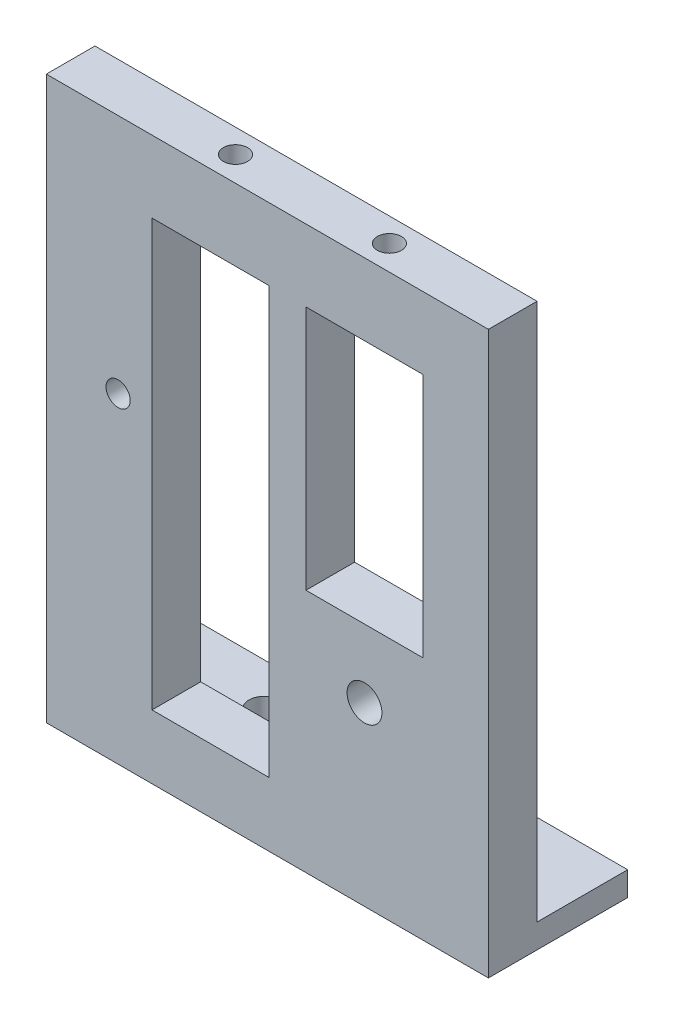
ISO-10303-21;
HEADER;
FILE_DESCRIPTION(('STEP AP214'),'2;1');
FILE_NAME('part.step','',(''),(''),'','','');
FILE_SCHEMA(('AUTOMOTIVE_DESIGN { 1 0 10303 214 1 1 1 1 }'));
ENDSEC;
DATA;
#1=APPLICATION_CONTEXT('core data for automotive mechanical design processes');
#2=APPLICATION_PROTOCOL_DEFINITION('international standard','automotive_design',2000,#1);
#3=PRODUCT_CONTEXT('',#1,'mechanical');
#4=PRODUCT('Part','Part','',(#3));
#5=PRODUCT_RELATED_PRODUCT_CATEGORY('part','',(#4));
#6=PRODUCT_DEFINITION_FORMATION('','',#4);
#7=PRODUCT_DEFINITION_CONTEXT('part definition',#1,'design');
#8=PRODUCT_DEFINITION('design','',#6,#7);
#9=PRODUCT_DEFINITION_SHAPE('','',#8);
#10=(LENGTH_UNIT() NAMED_UNIT(*) SI_UNIT(.MILLI.,.METRE.));
#11=(NAMED_UNIT(*) PLANE_ANGLE_UNIT() SI_UNIT($,.RADIAN.));
#12=(NAMED_UNIT(*) SI_UNIT($,.STERADIAN.) SOLID_ANGLE_UNIT());
#13=UNCERTAINTY_MEASURE_WITH_UNIT(LENGTH_MEASURE(1.E-05),#10,'distance_accuracy_value','');
#14=(GEOMETRIC_REPRESENTATION_CONTEXT(3) GLOBAL_UNCERTAINTY_ASSIGNED_CONTEXT((#13)) GLOBAL_UNIT_ASSIGNED_CONTEXT((#10,
#11,#12)) REPRESENTATION_CONTEXT('',''));
#15=CARTESIAN_POINT('',(0.,0.,0.));
#16=DIRECTION('',(0.,0.,1.));
#17=DIRECTION('',(1.,0.,0.));
#18=AXIS2_PLACEMENT_3D('',#15,#16,#17);
#19=CARTESIAN_POINT('',(-666.624609697633,1338.1785231422,-1240.98880700537));
#20=DIRECTION('',(-1.,0.,0.));
#21=DIRECTION('',(0.,0.,1.));
#22=AXIS2_PLACEMENT_3D('',#19,#20,#21);
#23=PLANE('',#22);
#24=DIRECTION('',(0.,1.,0.));
#25=VECTOR('',#24,1.);
#26=CARTESIAN_POINT('',(-666.624609697633,883.178523142196,-657.09689500453));
#27=LINE('',#26,#25);
#28=CARTESIAN_POINT('',(-666.624609697633,893.178523142196,-657.09689500453));
#29=VERTEX_POINT('',#28);
#30=CARTESIAN_POINT('',(-666.624609697633,1338.1785231422,-657.09689500453));
#31=VERTEX_POINT('',#30);
#32=EDGE_CURVE('E11',#29,#31,#27,.T.);
#33=ORIENTED_EDGE('',*,*,#32,.F.);
#34=DIRECTION('',(0.,0.,1.));
#35=VECTOR('',#34,1.);
#36=CARTESIAN_POINT('',(-666.624609697633,893.178523142196,0.));
#37=LINE('',#36,#35);
#38=CARTESIAN_POINT('',(-666.624609697633,893.178523142196,-732.09689500453));
#39=VERTEX_POINT('',#38);
#40=EDGE_CURVE('E294',#39,#29,#37,.T.);
#41=ORIENTED_EDGE('',*,*,#40,.F.);
#42=DIRECTION('',(0.,-1.,0.));
#43=VECTOR('',#42,1.);
#44=CARTESIAN_POINT('',(-666.624609697633,883.178523142196,-732.09689500453));
#45=LINE('',#44,#43);
#46=CARTESIAN_POINT('',(-666.624609697633,873.178523142196,-732.09689500453));
#47=VERTEX_POINT('',#46);
#48=EDGE_CURVE('E281',#39,#47,#45,.T.);
#49=ORIENTED_EDGE('',*,*,#48,.T.);
#50=DIRECTION('',(0.,0.,1.));
#51=VECTOR('',#50,1.);
#52=CARTESIAN_POINT('',(-666.624609697633,873.178523142196,-616.83689500453));
#53=LINE('',#52,#51);
#54=CARTESIAN_POINT('',(-666.624609697633,873.178523142196,-616.83689500453));
#55=VERTEX_POINT('',#54);
#56=EDGE_CURVE('E313',#47,#55,#53,.T.);
#57=ORIENTED_EDGE('',*,*,#56,.T.);
#58=DIRECTION('',(0.,-1.,0.));
#59=VECTOR('',#58,1.);
#60=CARTESIAN_POINT('',(-666.624609697633,1338.1785231422,-616.83689500453));
#61=LINE('',#60,#59);
#62=CARTESIAN_POINT('',(-666.624609697633,1338.1785231422,-616.83689500453));
#63=VERTEX_POINT('',#62);
#64=EDGE_CURVE('E205',#63,#55,#61,.T.);
#65=ORIENTED_EDGE('',*,*,#64,.F.);
#66=DIRECTION('',(0.,0.,1.));
#67=VECTOR('',#66,1.);
#68=CARTESIAN_POINT('',(-666.624609697633,1338.1785231422,-1240.98880700537));
#69=LINE('',#68,#67);
#70=EDGE_CURVE('E175',#31,#63,#69,.T.);
#71=ORIENTED_EDGE('',*,*,#70,.F.);
#72=EDGE_LOOP('',(#33,#41,#49,#57,#65,#71));
#73=FACE_BOUND('',#72,.T.);
#74=ADVANCED_FACE('F43',(#73),#23,.T.);
#75=CARTESIAN_POINT('',(-300.694609697633,1338.1785231422,-1240.98880700537));
#76=DIRECTION('',(1.,0.,0.));
#77=DIRECTION('',(0.,0.,-1.));
#78=AXIS2_PLACEMENT_3D('',#75,#76,#77);
#79=PLANE('',#78);
#80=DIRECTION('',(0.,0.,1.));
#81=VECTOR('',#80,1.);
#82=CARTESIAN_POINT('',(-300.694609697633,893.178523142196,-1240.98880700537));
#83=LINE('',#82,#81);
#84=CARTESIAN_POINT('',(-300.694609697633,893.178523142196,-732.09689500453));
#85=VERTEX_POINT('',#84);
#86=CARTESIAN_POINT('',(-300.694609697633,893.178523142196,-657.09689500453));
#87=VERTEX_POINT('',#86);
#88=EDGE_CURVE('E61',#85,#87,#83,.T.);
#89=ORIENTED_EDGE('',*,*,#88,.T.);
#90=DIRECTION('',(0.,1.,0.));
#91=VECTOR('',#90,1.);
#92=CARTESIAN_POINT('',(-300.694609697633,1387.0385231422,-657.09689500453));
#93=LINE('',#92,#91);
#94=CARTESIAN_POINT('',(-300.694609697633,1338.1785231422,-657.09689500453));
#95=VERTEX_POINT('',#94);
#96=EDGE_CURVE('E53',#95,#87,#93,.F.);
#97=ORIENTED_EDGE('',*,*,#96,.F.);
#98=DIRECTION('',(0.,0.,1.));
#99=VECTOR('',#98,1.);
#100=CARTESIAN_POINT('',(-300.694609697633,1338.1785231422,-1240.98880700537));
#101=LINE('',#100,#99);
#102=CARTESIAN_POINT('',(-300.694609697633,1338.1785231422,-616.83689500453));
#103=VERTEX_POINT('',#102);
#104=EDGE_CURVE('E177',#95,#103,#101,.T.);
#105=ORIENTED_EDGE('',*,*,#104,.T.);
#106=DIRECTION('',(0.,1.,0.));
#107=VECTOR('',#106,1.);
#108=CARTESIAN_POINT('',(-300.694609697633,1338.1785231422,-616.83689500453));
#109=LINE('',#108,#107);
#110=CARTESIAN_POINT('',(-300.694609697633,873.178523142196,-616.83689500453));
#111=VERTEX_POINT('',#110);
#112=EDGE_CURVE('E262',#111,#103,#109,.T.);
#113=ORIENTED_EDGE('',*,*,#112,.F.);
#114=DIRECTION('',(0.,0.,-1.));
#115=VECTOR('',#114,1.);
#116=CARTESIAN_POINT('',(-300.694609697633,873.178523142196,-616.83689500453));
#117=LINE('',#116,#115);
#118=CARTESIAN_POINT('',(-300.694609697633,873.178523142196,-732.09689500453));
#119=VERTEX_POINT('',#118);
#120=EDGE_CURVE('E307',#111,#119,#117,.T.);
#121=ORIENTED_EDGE('',*,*,#120,.T.);
#122=DIRECTION('',(0.,-1.,0.));
#123=VECTOR('',#122,1.);
#124=CARTESIAN_POINT('',(-300.694609697633,1338.1785231422,-732.09689500453));
#125=LINE('',#124,#123);
#126=EDGE_CURVE('E276',#85,#119,#125,.T.);
#127=ORIENTED_EDGE('',*,*,#126,.F.);
#128=EDGE_LOOP('',(#89,#97,#105,#113,#121,#127));
#129=FACE_BOUND('',#128,.T.);
#130=ADVANCED_FACE('F338',(#129),#79,.T.);
#131=CARTESIAN_POINT('',(-400.694609697633,883.177523142196,-697.09689500453));
#132=DIRECTION('',(0.,1.,0.));
#133=DIRECTION('',(0.,0.,1.));
#134=AXIS2_PLACEMENT_3D('',#131,#132,#133);
#135=CYLINDRICAL_SURFACE('',#134,12.5);
#136=CARTESIAN_POINT('',(-400.694609697633,893.178523142196,-697.09689500453));
#137=DIRECTION('',(0.,1.,0.));
#138=DIRECTION('',(0.,0.,1.));
#139=AXIS2_PLACEMENT_3D('',#136,#137,#138);
#140=CIRCLE('',#139,12.5);
#141=CARTESIAN_POINT('',(-400.694609697633,893.178523142196,-684.59689500453));
#142=VERTEX_POINT('',#141);
#143=EDGE_CURVE('E285',#142,#142,#140,.F.);
#144=ORIENTED_EDGE('',*,*,#143,.F.);
#145=EDGE_LOOP('',(#144));
#146=FACE_BOUND('',#145,.T.);
#147=CARTESIAN_POINT('',(-400.694609697633,873.178523142196,-697.09689500453));
#148=DIRECTION('',(0.,1.,0.));
#149=DIRECTION('',(0.,0.,1.));
#150=AXIS2_PLACEMENT_3D('',#147,#148,#149);
#151=CIRCLE('',#150,12.5);
#152=CARTESIAN_POINT('',(-400.694609697633,873.178523142196,-684.59689500453));
#153=VERTEX_POINT('',#152);
#154=EDGE_CURVE('E298',#153,#153,#151,.T.);
#155=ORIENTED_EDGE('',*,*,#154,.F.);
#156=EDGE_LOOP('',(#155));
#157=FACE_BOUND('',#156,.T.);
#158=ADVANCED_FACE('F375',(#146,#157),#135,.F.);
#159=CARTESIAN_POINT('',(-566.624609697633,883.177523142196,-697.09689500453));
#160=DIRECTION('',(0.,1.,0.));
#161=DIRECTION('',(0.,0.,1.));
#162=AXIS2_PLACEMENT_3D('',#159,#160,#161);
#163=CYLINDRICAL_SURFACE('',#162,12.5);
#164=CARTESIAN_POINT('',(-566.624609697633,893.178523142196,-697.09689500453));
#165=DIRECTION('',(0.,1.,0.));
#166=DIRECTION('',(0.,0.,1.));
#167=AXIS2_PLACEMENT_3D('',#164,#165,#166);
#168=CIRCLE('',#167,12.5);
#169=CARTESIAN_POINT('',(-566.624609697633,893.178523142196,-684.59689500453));
#170=VERTEX_POINT('',#169);
#171=EDGE_CURVE('E288',#170,#170,#168,.F.);
#172=ORIENTED_EDGE('',*,*,#171,.F.);
#173=EDGE_LOOP('',(#172));
#174=FACE_BOUND('',#173,.T.);
#175=CARTESIAN_POINT('',(-566.624609697633,873.178523142196,-697.09689500453));
#176=DIRECTION('',(0.,1.,0.));
#177=DIRECTION('',(0.,0.,1.));
#178=AXIS2_PLACEMENT_3D('',#175,#176,#177);
#179=CIRCLE('',#178,12.5);
#180=CARTESIAN_POINT('',(-566.624609697633,873.178523142196,-684.59689500453));
#181=VERTEX_POINT('',#180);
#182=EDGE_CURVE('E299',#181,#181,#179,.T.);
#183=ORIENTED_EDGE('',*,*,#182,.F.);
#184=EDGE_LOOP('',(#183));
#185=FACE_BOUND('',#184,.T.);
#186=ADVANCED_FACE('F509',(#174,#185),#163,.F.);
#187=CARTESIAN_POINT('',(-666.624609697633,883.178523142196,-732.09689500453));
#188=DIRECTION('',(0.,0.,1.));
#189=DIRECTION('',(1.,0.,0.));
#190=AXIS2_PLACEMENT_3D('',#187,#188,#189);
#191=PLANE('',#190);
#192=DIRECTION('',(1.,0.,0.));
#193=VECTOR('',#192,1.);
#194=CARTESIAN_POINT('',(-666.624609697633,893.178523142196,-732.09689500453));
#195=LINE('',#194,#193);
#196=EDGE_CURVE('E291',#39,#85,#195,.T.);
#197=ORIENTED_EDGE('',*,*,#196,.T.);
#198=ORIENTED_EDGE('',*,*,#126,.T.);
#199=DIRECTION('',(-1.,0.,0.));
#200=VECTOR('',#199,1.);
#201=CARTESIAN_POINT('',(-666.624609697633,873.178523142196,-732.09689500453));
#202=LINE('',#201,#200);
#203=EDGE_CURVE('E310',#119,#47,#202,.T.);
#204=ORIENTED_EDGE('',*,*,#203,.T.);
#205=ORIENTED_EDGE('',*,*,#48,.F.);
#206=EDGE_LOOP('',(#197,#198,#204,#205));
#207=FACE_BOUND('',#206,.T.);
#208=ADVANCED_FACE('F333',(#207),#191,.F.);
#209=CARTESIAN_POINT('',(-666.624609697633,1338.1785231422,-1240.98880700537));
#210=DIRECTION('',(0.,1.,0.));
#211=DIRECTION('',(0.,0.,1.));
#212=AXIS2_PLACEMENT_3D('',#209,#210,#211);
#213=PLANE('',#212);
#214=CARTESIAN_POINT('',(-530.676153664108,1338.1785231422,-637.44689500453));
#215=DIRECTION('',(0.,1.,0.));
#216=DIRECTION('',(0.,0.,1.));
#217=AXIS2_PLACEMENT_3D('',#214,#215,#216);
#218=CIRCLE('',#217,9.99999999999974);
#219=CARTESIAN_POINT('',(-530.676153664108,1338.1785231422,-647.44689500453));
#220=VERTEX_POINT('',#219);
#221=EDGE_CURVE('E214',#220,#220,#218,.F.);
#222=ORIENTED_EDGE('',*,*,#221,.T.);
#223=EDGE_LOOP('',(#222));
#224=FACE_BOUND('',#223,.T.);
#225=CARTESIAN_POINT('',(-403.264609697647,1338.1785231422,-637.44689500453));
#226=DIRECTION('',(0.,1.,0.));
#227=DIRECTION('',(0.,0.,1.));
#228=AXIS2_PLACEMENT_3D('',#225,#226,#227);
#229=CIRCLE('',#228,9.99999999999979);
#230=CARTESIAN_POINT('',(-403.264609697647,1338.1785231422,-647.44689500453));
#231=VERTEX_POINT('',#230);
#232=EDGE_CURVE('E269',#231,#231,#229,.F.);
#233=ORIENTED_EDGE('',*,*,#232,.T.);
#234=EDGE_LOOP('',(#233));
#235=FACE_BOUND('',#234,.T.);
#236=ORIENTED_EDGE('',*,*,#104,.F.);
#237=DIRECTION('',(1.,0.,0.));
#238=VECTOR('',#237,1.);
#239=CARTESIAN_POINT('',(-3344.26460969763,1338.1785231422,-657.09689500453));
#240=LINE('',#239,#238);
#241=EDGE_CURVE('E178',#95,#31,#240,.F.);
#242=ORIENTED_EDGE('',*,*,#241,.T.);
#243=ORIENTED_EDGE('',*,*,#70,.T.);
#244=DIRECTION('',(-1.,0.,0.));
#245=VECTOR('',#244,1.);
#246=CARTESIAN_POINT('',(-666.624609697633,1338.1785231422,-616.83689500453));
#247=LINE('',#246,#245);
#248=EDGE_CURVE('E174',#103,#63,#247,.T.);
#249=ORIENTED_EDGE('',*,*,#248,.F.);
#250=EDGE_LOOP('',(#236,#242,#243,#249));
#251=FACE_BOUND('',#250,.T.);
#252=ADVANCED_FACE('F345',(#224,#235,#251),#213,.T.);
#253=CARTESIAN_POINT('',(-579.131153664108,1278.71663831577,-1240.98880700537));
#254=DIRECTION('',(-1.,0.,0.));
#255=DIRECTION('',(0.,0.,1.));
#256=AXIS2_PLACEMENT_3D('',#253,#254,#255);
#257=PLANE('',#256);
#258=DIRECTION('',(0.,1.,0.));
#259=VECTOR('',#258,1.);
#260=CARTESIAN_POINT('',(-579.131153664108,1278.71663831577,-657.09689500453));
#261=LINE('',#260,#259);
#262=CARTESIAN_POINT('',(-579.131153664108,1278.71663831577,-657.09689500453));
#263=VERTEX_POINT('',#262);
#264=CARTESIAN_POINT('',(-579.131153664108,926.126638315769,-657.09689500453));
#265=VERTEX_POINT('',#264);
#266=EDGE_CURVE('E222',#263,#265,#261,.F.);
#267=ORIENTED_EDGE('',*,*,#266,.F.);
#268=DIRECTION('',(0.,0.,1.));
#269=VECTOR('',#268,1.);
#270=CARTESIAN_POINT('',(-579.131153664108,1278.71663831577,-1240.98880700537));
#271=LINE('',#270,#269);
#272=CARTESIAN_POINT('',(-579.131153664108,1278.71663831577,-616.83689500453));
#273=VERTEX_POINT('',#272);
#274=EDGE_CURVE('E180',#263,#273,#271,.T.);
#275=ORIENTED_EDGE('',*,*,#274,.T.);
#276=DIRECTION('',(0.,-1.,0.));
#277=VECTOR('',#276,1.);
#278=CARTESIAN_POINT('',(-579.131153664108,1278.71663831577,-616.83689500453));
#279=LINE('',#278,#277);
#280=CARTESIAN_POINT('',(-579.131153664108,926.126638315769,-616.83689500453));
#281=VERTEX_POINT('',#280);
#282=EDGE_CURVE('E182',#273,#281,#279,.T.);
#283=ORIENTED_EDGE('',*,*,#282,.T.);
#284=DIRECTION('',(0.,0.,1.));
#285=VECTOR('',#284,1.);
#286=CARTESIAN_POINT('',(-579.131153664108,926.126638315769,-1240.98880700537));
#287=LINE('',#286,#285);
#288=EDGE_CURVE('E189',#265,#281,#287,.T.);
#289=ORIENTED_EDGE('',*,*,#288,.F.);
#290=EDGE_LOOP('',(#267,#275,#283,#289));
#291=FACE_BOUND('',#290,.T.);
#292=ADVANCED_FACE('F249',(#291),#257,.F.);
#293=CARTESIAN_POINT('',(-579.131153664108,1278.71663831577,-1240.98880700537));
#294=DIRECTION('',(0.,1.,0.));
#295=DIRECTION('',(0.,0.,1.));
#296=AXIS2_PLACEMENT_3D('',#293,#294,#295);
#297=PLANE('',#296);
#298=CARTESIAN_POINT('',(-530.676153664108,1278.71663831577,-637.44689500453));
#299=DIRECTION('',(0.,1.,0.));
#300=DIRECTION('',(0.,0.,1.));
#301=AXIS2_PLACEMENT_3D('',#298,#299,#300);
#302=CIRCLE('',#301,9.99999999999974);
#303=CARTESIAN_POINT('',(-530.676153664108,1278.71663831577,-647.44689500453));
#304=VERTEX_POINT('',#303);
#305=EDGE_CURVE('E272',#304,#304,#302,.F.);
#306=ORIENTED_EDGE('',*,*,#305,.F.);
#307=EDGE_LOOP('',(#306));
#308=FACE_BOUND('',#307,.T.);
#309=DIRECTION('',(1.,0.,0.));
#310=VECTOR('',#309,1.);
#311=CARTESIAN_POINT('',(-482.221153664109,1278.71663831577,-657.09689500453));
#312=LINE('',#311,#310);
#313=CARTESIAN_POINT('',(-482.221153664109,1278.71663831577,-657.09689500453));
#314=VERTEX_POINT('',#313);
#315=EDGE_CURVE('E226',#314,#263,#312,.F.);
#316=ORIENTED_EDGE('',*,*,#315,.F.);
#317=DIRECTION('',(0.,0.,1.));
#318=VECTOR('',#317,1.);
#319=CARTESIAN_POINT('',(-482.221153664109,1278.71663831577,-1240.98880700537));
#320=LINE('',#319,#318);
#321=CARTESIAN_POINT('',(-482.221153664109,1278.71663831577,-616.83689500453));
#322=VERTEX_POINT('',#321);
#323=EDGE_CURVE('E183',#314,#322,#320,.T.);
#324=ORIENTED_EDGE('',*,*,#323,.T.);
#325=DIRECTION('',(-1.,0.,0.));
#326=VECTOR('',#325,1.);
#327=CARTESIAN_POINT('',(-579.131153664108,1278.71663831577,-616.83689500453));
#328=LINE('',#327,#326);
#329=EDGE_CURVE('E185',#322,#273,#328,.T.);
#330=ORIENTED_EDGE('',*,*,#329,.T.);
#331=ORIENTED_EDGE('',*,*,#274,.F.);
#332=EDGE_LOOP('',(#316,#324,#330,#331));
#333=FACE_BOUND('',#332,.T.);
#334=ADVANCED_FACE('F244',(#308,#333),#297,.F.);
#335=CARTESIAN_POINT('',(-482.221153664109,1278.71663831577,-1240.98880700537));
#336=DIRECTION('',(1.,0.,0.));
#337=DIRECTION('',(0.,0.,-1.));
#338=AXIS2_PLACEMENT_3D('',#335,#336,#337);
#339=PLANE('',#338);
#340=DIRECTION('',(0.,1.,0.));
#341=VECTOR('',#340,1.);
#342=CARTESIAN_POINT('',(-482.221153664109,926.126638315769,-657.09689500453));
#343=LINE('',#342,#341);
#344=CARTESIAN_POINT('',(-482.221153664109,926.126638315769,-657.09689500453));
#345=VERTEX_POINT('',#344);
#346=EDGE_CURVE('E147',#345,#314,#343,.T.);
#347=ORIENTED_EDGE('',*,*,#346,.F.);
#348=DIRECTION('',(0.,0.,1.));
#349=VECTOR('',#348,1.);
#350=CARTESIAN_POINT('',(-482.221153664109,926.126638315769,-1240.98880700537));
#351=LINE('',#350,#349);
#352=CARTESIAN_POINT('',(-482.221153664109,926.126638315769,-616.83689500453));
#353=VERTEX_POINT('',#352);
#354=EDGE_CURVE('E186',#345,#353,#351,.T.);
#355=ORIENTED_EDGE('',*,*,#354,.T.);
#356=DIRECTION('',(0.,1.,0.));
#357=VECTOR('',#356,1.);
#358=CARTESIAN_POINT('',(-482.221153664109,1278.71663831577,-616.83689500453));
#359=LINE('',#358,#357);
#360=EDGE_CURVE('E188',#353,#322,#359,.T.);
#361=ORIENTED_EDGE('',*,*,#360,.T.);
#362=ORIENTED_EDGE('',*,*,#323,.F.);
#363=EDGE_LOOP('',(#347,#355,#361,#362));
#364=FACE_BOUND('',#363,.T.);
#365=ADVANCED_FACE('F237',(#364),#339,.F.);
#366=CARTESIAN_POINT('',(-579.131153664108,926.126638315769,-1240.98880700537));
#367=DIRECTION('',(0.,-1.,0.));
#368=DIRECTION('',(0.,0.,-1.));
#369=AXIS2_PLACEMENT_3D('',#366,#367,#368);
#370=PLANE('',#369);
#371=DIRECTION('',(1.,0.,0.));
#372=VECTOR('',#371,1.);
#373=CARTESIAN_POINT('',(-579.131153664108,926.126638315769,-657.09689500453));
#374=LINE('',#373,#372);
#375=EDGE_CURVE('E218',#265,#345,#374,.T.);
#376=ORIENTED_EDGE('',*,*,#375,.F.);
#377=ORIENTED_EDGE('',*,*,#288,.T.);
#378=DIRECTION('',(1.,0.,0.));
#379=VECTOR('',#378,1.);
#380=CARTESIAN_POINT('',(-579.131153664108,926.126638315769,-616.83689500453));
#381=LINE('',#380,#379);
#382=EDGE_CURVE('E154',#281,#353,#381,.T.);
#383=ORIENTED_EDGE('',*,*,#382,.T.);
#384=ORIENTED_EDGE('',*,*,#354,.F.);
#385=EDGE_LOOP('',(#376,#377,#383,#384));
#386=FACE_BOUND('',#385,.T.);
#387=ADVANCED_FACE('F253',(#386),#370,.F.);
#388=CARTESIAN_POINT('',(-451.719609697648,1278.71663831577,-1240.98880700537));
#389=DIRECTION('',(-1.,0.,0.));
#390=DIRECTION('',(0.,0.,1.));
#391=AXIS2_PLACEMENT_3D('',#388,#389,#390);
#392=PLANE('',#391);
#393=DIRECTION('',(0.,1.,0.));
#394=VECTOR('',#393,1.);
#395=CARTESIAN_POINT('',(-451.719609697648,1278.71663831577,-657.09689500453));
#396=LINE('',#395,#394);
#397=CARTESIAN_POINT('',(-451.719609697648,1278.71663831577,-657.09689500453));
#398=VERTEX_POINT('',#397);
#399=CARTESIAN_POINT('',(-451.719609697648,1075.62062548843,-657.09689500453));
#400=VERTEX_POINT('',#399);
#401=EDGE_CURVE('E141',#398,#400,#396,.F.);
#402=ORIENTED_EDGE('',*,*,#401,.F.);
#403=DIRECTION('',(0.,0.,1.));
#404=VECTOR('',#403,1.);
#405=CARTESIAN_POINT('',(-451.719609697648,1278.71663831577,-1240.98880700537));
#406=LINE('',#405,#404);
#407=CARTESIAN_POINT('',(-451.719609697648,1278.71663831577,-616.83689500453));
#408=VERTEX_POINT('',#407);
#409=EDGE_CURVE('E143',#398,#408,#406,.T.);
#410=ORIENTED_EDGE('',*,*,#409,.T.);
#411=DIRECTION('',(0.,-1.,0.));
#412=VECTOR('',#411,1.);
#413=CARTESIAN_POINT('',(-451.719609697648,1278.71663831577,-616.83689500453));
#414=LINE('',#413,#412);
#415=CARTESIAN_POINT('',(-451.719609697648,1075.62062548843,-616.83689500453));
#416=VERTEX_POINT('',#415);
#417=EDGE_CURVE('E153',#408,#416,#414,.T.);
#418=ORIENTED_EDGE('',*,*,#417,.T.);
#419=DIRECTION('',(0.,0.,1.));
#420=VECTOR('',#419,1.);
#421=CARTESIAN_POINT('',(-451.719609697648,1075.62062548843,-1240.98880700537));
#422=LINE('',#421,#420);
#423=EDGE_CURVE('E47',#400,#416,#422,.T.);
#424=ORIENTED_EDGE('',*,*,#423,.F.);
#425=EDGE_LOOP('',(#402,#410,#418,#424));
#426=FACE_BOUND('',#425,.T.);
#427=ADVANCED_FACE('F142',(#426),#392,.F.);
#428=CARTESIAN_POINT('',(-451.719609697648,1278.71663831577,-1240.98880700537));
#429=DIRECTION('',(0.,1.,0.));
#430=DIRECTION('',(0.,0.,1.));
#431=AXIS2_PLACEMENT_3D('',#428,#429,#430);
#432=PLANE('',#431);
#433=CARTESIAN_POINT('',(-403.264609697647,1278.71663831577,-637.44689500453));
#434=DIRECTION('',(0.,1.,0.));
#435=DIRECTION('',(0.,0.,1.));
#436=AXIS2_PLACEMENT_3D('',#433,#434,#435);
#437=CIRCLE('',#436,9.99999999999979);
#438=CARTESIAN_POINT('',(-403.264609697647,1278.71663831577,-647.44689500453));
#439=VERTEX_POINT('',#438);
#440=EDGE_CURVE('E273',#439,#439,#437,.F.);
#441=ORIENTED_EDGE('',*,*,#440,.F.);
#442=EDGE_LOOP('',(#441));
#443=FACE_BOUND('',#442,.T.);
#444=DIRECTION('',(1.,0.,0.));
#445=VECTOR('',#444,1.);
#446=CARTESIAN_POINT('',(-354.809609697648,1278.71663831577,-657.09689500453));
#447=LINE('',#446,#445);
#448=CARTESIAN_POINT('',(-354.809609697648,1278.71663831577,-657.09689500453));
#449=VERTEX_POINT('',#448);
#450=EDGE_CURVE('E130',#449,#398,#447,.F.);
#451=ORIENTED_EDGE('',*,*,#450,.F.);
#452=DIRECTION('',(0.,0.,1.));
#453=VECTOR('',#452,1.);
#454=CARTESIAN_POINT('',(-354.809609697648,1278.71663831577,-1240.98880700537));
#455=LINE('',#454,#453);
#456=CARTESIAN_POINT('',(-354.809609697648,1278.71663831577,-616.83689500453));
#457=VERTEX_POINT('',#456);
#458=EDGE_CURVE('E126',#449,#457,#455,.T.);
#459=ORIENTED_EDGE('',*,*,#458,.T.);
#460=DIRECTION('',(-1.,0.,0.));
#461=VECTOR('',#460,1.);
#462=CARTESIAN_POINT('',(-451.719609697648,1278.71663831577,-616.83689500453));
#463=LINE('',#462,#461);
#464=EDGE_CURVE('E151',#457,#408,#463,.T.);
#465=ORIENTED_EDGE('',*,*,#464,.T.);
#466=ORIENTED_EDGE('',*,*,#409,.F.);
#467=EDGE_LOOP('',(#451,#459,#465,#466));
#468=FACE_BOUND('',#467,.T.);
#469=ADVANCED_FACE('F149',(#443,#468),#432,.F.);
#470=CARTESIAN_POINT('',(-354.809609697648,1278.71663831577,-1240.98880700537));
#471=DIRECTION('',(1.,0.,0.));
#472=DIRECTION('',(0.,0.,-1.));
#473=AXIS2_PLACEMENT_3D('',#470,#471,#472);
#474=PLANE('',#473);
#475=DIRECTION('',(0.,1.,0.));
#476=VECTOR('',#475,1.);
#477=CARTESIAN_POINT('',(-354.809609697648,926.126638315769,-657.09689500453));
#478=LINE('',#477,#476);
#479=CARTESIAN_POINT('',(-354.809609697648,1075.62062548843,-657.09689500453));
#480=VERTEX_POINT('',#479);
#481=EDGE_CURVE('E158',#480,#449,#478,.T.);
#482=ORIENTED_EDGE('',*,*,#481,.F.);
#483=DIRECTION('',(0.,0.,1.));
#484=VECTOR('',#483,1.);
#485=CARTESIAN_POINT('',(-354.809609697648,1075.62062548843,-1240.98880700537));
#486=LINE('',#485,#484);
#487=CARTESIAN_POINT('',(-354.809609697648,1075.62062548843,-616.83689500453));
#488=VERTEX_POINT('',#487);
#489=EDGE_CURVE('E86',#480,#488,#486,.T.);
#490=ORIENTED_EDGE('',*,*,#489,.T.);
#491=DIRECTION('',(0.,1.,0.));
#492=VECTOR('',#491,1.);
#493=CARTESIAN_POINT('',(-354.809609697648,1278.71663831577,-616.83689500453));
#494=LINE('',#493,#492);
#495=EDGE_CURVE('E170',#488,#457,#494,.T.);
#496=ORIENTED_EDGE('',*,*,#495,.T.);
#497=ORIENTED_EDGE('',*,*,#458,.F.);
#498=EDGE_LOOP('',(#482,#490,#496,#497));
#499=FACE_BOUND('',#498,.T.);
#500=ADVANCED_FACE('F366',(#499),#474,.F.);
#501=CARTESIAN_POINT('',(-451.719609697648,1075.62062548843,-1240.98880700537));
#502=DIRECTION('',(0.,-1.,0.));
#503=DIRECTION('',(0.,0.,-1.));
#504=AXIS2_PLACEMENT_3D('',#501,#502,#503);
#505=PLANE('',#504);
#506=DIRECTION('',(1.,0.,0.));
#507=VECTOR('',#506,1.);
#508=CARTESIAN_POINT('',(-336.124921360375,1075.62062548843,-657.09689500453));
#509=LINE('',#508,#507);
#510=EDGE_CURVE('E167',#480,#400,#509,.F.);
#511=ORIENTED_EDGE('',*,*,#510,.T.);
#512=ORIENTED_EDGE('',*,*,#423,.T.);
#513=DIRECTION('',(1.,0.,0.));
#514=VECTOR('',#513,1.);
#515=CARTESIAN_POINT('',(-451.719609697648,1075.62062548843,-616.83689500453));
#516=LINE('',#515,#514);
#517=EDGE_CURVE('E197',#416,#488,#516,.T.);
#518=ORIENTED_EDGE('',*,*,#517,.T.);
#519=ORIENTED_EDGE('',*,*,#489,.F.);
#520=EDGE_LOOP('',(#511,#512,#518,#519));
#521=FACE_BOUND('',#520,.T.);
#522=ADVANCED_FACE('F358',(#521),#505,.F.);
#523=CARTESIAN_POINT('',(-607.210787573154,1138.80496269336,-1240.98880700537));
#524=DIRECTION('',(0.,0.,1.));
#525=DIRECTION('',(1.,0.,0.));
#526=AXIS2_PLACEMENT_3D('',#523,#524,#525);
#527=CYLINDRICAL_SURFACE('',#526,9.99999999999988);
#528=CARTESIAN_POINT('',(-607.210787573154,1138.80496269336,-616.83689500453));
#529=DIRECTION('',(0.,0.,1.));
#530=DIRECTION('',(1.,0.,0.));
#531=AXIS2_PLACEMENT_3D('',#528,#529,#530);
#532=CIRCLE('',#531,9.99999999999988);
#533=CARTESIAN_POINT('',(-597.210787573154,1138.80496269336,-616.83689500453));
#534=VERTEX_POINT('',#533);
#535=EDGE_CURVE('E199',#534,#534,#532,.T.);
#536=ORIENTED_EDGE('',*,*,#535,.T.);
#537=EDGE_LOOP('',(#536));
#538=FACE_BOUND('',#537,.T.);
#539=CARTESIAN_POINT('',(-607.210787573154,1138.80496269336,-657.09689500453));
#540=DIRECTION('',(0.,0.,1.));
#541=DIRECTION('',(1.,0.,0.));
#542=AXIS2_PLACEMENT_3D('',#539,#540,#541);
#543=CIRCLE('',#542,10.);
#544=CARTESIAN_POINT('',(-597.210787573154,1138.80496269336,-657.09689500453));
#545=VERTEX_POINT('',#544);
#546=EDGE_CURVE('E163',#545,#545,#543,.T.);
#547=ORIENTED_EDGE('',*,*,#546,.F.);
#548=EDGE_LOOP('',(#547));
#549=FACE_BOUND('',#548,.T.);
#550=ADVANCED_FACE('F355',(#538,#549),#527,.F.);
#551=CARTESIAN_POINT('',(-403.264609697647,1019.1785231422,-1240.98880700537));
#552=DIRECTION('',(0.,0.,1.));
#553=DIRECTION('',(1.,0.,0.));
#554=AXIS2_PLACEMENT_3D('',#551,#552,#553);
#555=CYLINDRICAL_SURFACE('',#554,14.4381275614837);
#556=CARTESIAN_POINT('',(-403.264609697647,1019.1785231422,-616.83689500453));
#557=DIRECTION('',(0.,0.,1.));
#558=DIRECTION('',(1.,0.,0.));
#559=AXIS2_PLACEMENT_3D('',#556,#557,#558);
#560=CIRCLE('',#559,14.4381275614837);
#561=CARTESIAN_POINT('',(-388.826482136163,1019.1785231422,-616.83689500453));
#562=VERTEX_POINT('',#561);
#563=EDGE_CURVE('E203',#562,#562,#560,.T.);
#564=ORIENTED_EDGE('',*,*,#563,.T.);
#565=EDGE_LOOP('',(#564));
#566=FACE_BOUND('',#565,.T.);
#567=CARTESIAN_POINT('',(-403.264609697647,1019.1785231422,-657.09689500453));
#568=DIRECTION('',(0.,0.,1.));
#569=DIRECTION('',(1.,0.,0.));
#570=AXIS2_PLACEMENT_3D('',#567,#568,#569);
#571=CIRCLE('',#570,14.4381275614838);
#572=CARTESIAN_POINT('',(-388.826482136163,1019.1785231422,-657.09689500453));
#573=VERTEX_POINT('',#572);
#574=EDGE_CURVE('E210',#573,#573,#571,.T.);
#575=ORIENTED_EDGE('',*,*,#574,.F.);
#576=EDGE_LOOP('',(#575));
#577=FACE_BOUND('',#576,.T.);
#578=ADVANCED_FACE('F357',(#566,#577),#555,.F.);
#579=CARTESIAN_POINT('',(0.,0.,-616.83689500453));
#580=DIRECTION('',(0.,0.,1.));
#581=DIRECTION('',(1.,0.,0.));
#582=AXIS2_PLACEMENT_3D('',#579,#580,#581);
#583=PLANE('',#582);
#584=ORIENTED_EDGE('',*,*,#563,.F.);
#585=EDGE_LOOP('',(#584));
#586=FACE_BOUND('',#585,.T.);
#587=ORIENTED_EDGE('',*,*,#535,.F.);
#588=EDGE_LOOP('',(#587));
#589=FACE_BOUND('',#588,.T.);
#590=ORIENTED_EDGE('',*,*,#417,.F.);
#591=ORIENTED_EDGE('',*,*,#464,.F.);
#592=ORIENTED_EDGE('',*,*,#495,.F.);
#593=ORIENTED_EDGE('',*,*,#517,.F.);
#594=EDGE_LOOP('',(#590,#591,#592,#593));
#595=FACE_BOUND('',#594,.T.);
#596=ORIENTED_EDGE('',*,*,#282,.F.);
#597=ORIENTED_EDGE('',*,*,#329,.F.);
#598=ORIENTED_EDGE('',*,*,#360,.F.);
#599=ORIENTED_EDGE('',*,*,#382,.F.);
#600=EDGE_LOOP('',(#596,#597,#598,#599));
#601=FACE_BOUND('',#600,.T.);
#602=ORIENTED_EDGE('',*,*,#64,.T.);
#603=DIRECTION('',(1.,0.,0.));
#604=VECTOR('',#603,1.);
#605=CARTESIAN_POINT('',(-666.624609697633,873.178523142196,-616.83689500453));
#606=LINE('',#605,#604);
#607=EDGE_CURVE('E302',#55,#111,#606,.T.);
#608=ORIENTED_EDGE('',*,*,#607,.T.);
#609=ORIENTED_EDGE('',*,*,#112,.T.);
#610=ORIENTED_EDGE('',*,*,#248,.T.);
#611=EDGE_LOOP('',(#602,#608,#609,#610));
#612=FACE_BOUND('',#611,.T.);
#613=ADVANCED_FACE('F255',(#586,#589,#595,#601,#612),#583,.T.);
#614=CARTESIAN_POINT('',(51.6353903023665,883.178523142196,-657.09689500453));
#615=DIRECTION('',(0.,0.,-1.));
#616=DIRECTION('',(-1.,0.,0.));
#617=AXIS2_PLACEMENT_3D('',#614,#615,#616);
#618=PLANE('',#617);
#619=ORIENTED_EDGE('',*,*,#96,.T.);
#620=DIRECTION('',(1.,0.,0.));
#621=VECTOR('',#620,1.);
#622=CARTESIAN_POINT('',(-666.624609697633,893.178523142196,-657.09689500453));
#623=LINE('',#622,#621);
#624=EDGE_CURVE('E292',#29,#87,#623,.T.);
#625=ORIENTED_EDGE('',*,*,#624,.F.);
#626=ORIENTED_EDGE('',*,*,#32,.T.);
#627=ORIENTED_EDGE('',*,*,#241,.F.);
#628=EDGE_LOOP('',(#619,#625,#626,#627));
#629=FACE_BOUND('',#628,.T.);
#630=ORIENTED_EDGE('',*,*,#546,.T.);
#631=EDGE_LOOP('',(#630));
#632=FACE_BOUND('',#631,.T.);
#633=ORIENTED_EDGE('',*,*,#510,.F.);
#634=ORIENTED_EDGE('',*,*,#481,.T.);
#635=ORIENTED_EDGE('',*,*,#450,.T.);
#636=ORIENTED_EDGE('',*,*,#401,.T.);
#637=EDGE_LOOP('',(#633,#634,#635,#636));
#638=FACE_BOUND('',#637,.T.);
#639=ORIENTED_EDGE('',*,*,#346,.T.);
#640=ORIENTED_EDGE('',*,*,#315,.T.);
#641=ORIENTED_EDGE('',*,*,#266,.T.);
#642=ORIENTED_EDGE('',*,*,#375,.T.);
#643=EDGE_LOOP('',(#639,#640,#641,#642));
#644=FACE_BOUND('',#643,.T.);
#645=ORIENTED_EDGE('',*,*,#574,.T.);
#646=EDGE_LOOP('',(#645));
#647=FACE_BOUND('',#646,.T.);
#648=ADVANCED_FACE('F45',(#629,#632,#638,#644,#647),#618,.T.);
#649=CARTESIAN_POINT('',(-403.264609697647,1338.1785351422,-637.44689500453));
#650=DIRECTION('',(0.,-1.,0.));
#651=DIRECTION('',(0.,0.,-1.));
#652=AXIS2_PLACEMENT_3D('',#649,#650,#651);
#653=CYLINDRICAL_SURFACE('',#652,9.99999999999979);
#654=CARTESIAN_POINT('',(-403.264609697647,1338.1785231422,-647.44689500453));
#655=CARTESIAN_POINT('',(-403.264609697647,1337.55912850859,-647.44689500453));
#656=CARTESIAN_POINT('',(-403.264609697647,1336.93973387498,-647.44689500453));
#657=CARTESIAN_POINT('',(-403.264609697647,1335.70094460776,-647.44689500453));
#658=CARTESIAN_POINT('',(-403.264609697647,1335.08154997415,-647.44689500453));
#659=CARTESIAN_POINT('',(-403.264609697647,1333.84276070694,-647.44689500453));
#660=CARTESIAN_POINT('',(-403.264609697647,1333.22336607333,-647.44689500453));
#661=CARTESIAN_POINT('',(-403.264609697647,1331.98457680611,-647.44689500453));
#662=CARTESIAN_POINT('',(-403.264609697647,1331.3651821725,-647.44689500453));
#663=CARTESIAN_POINT('',(-403.264609697647,1330.12639290528,-647.44689500453));
#664=CARTESIAN_POINT('',(-403.264609697647,1329.50699827168,-647.44689500453));
#665=CARTESIAN_POINT('',(-403.264609697647,1328.26820900446,-647.44689500453));
#666=CARTESIAN_POINT('',(-403.264609697647,1327.64881437085,-647.44689500453));
#667=CARTESIAN_POINT('',(-403.264609697647,1326.41002510363,-647.44689500453));
#668=CARTESIAN_POINT('',(-403.264609697647,1325.79063047002,-647.44689500453));
#669=CARTESIAN_POINT('',(-403.264609697647,1324.55184120281,-647.44689500453));
#670=CARTESIAN_POINT('',(-403.264609697647,1323.9324465692,-647.44689500453));
#671=CARTESIAN_POINT('',(-403.264609697647,1322.69365730198,-647.44689500453));
#672=CARTESIAN_POINT('',(-403.264609697647,1322.07426266837,-647.44689500453));
#673=CARTESIAN_POINT('',(-403.264609697647,1320.83547340116,-647.44689500453));
#674=CARTESIAN_POINT('',(-403.264609697647,1320.21607876755,-647.44689500453));
#675=CARTESIAN_POINT('',(-403.264609697647,1318.97728950033,-647.44689500453));
#676=CARTESIAN_POINT('',(-403.264609697647,1318.35789486672,-647.44689500453));
#677=CARTESIAN_POINT('',(-403.264609697647,1317.1191055995,-647.44689500453));
#678=CARTESIAN_POINT('',(-403.264609697647,1316.49971096589,-647.44689500453));
#679=CARTESIAN_POINT('',(-403.264609697647,1315.26092169868,-647.44689500453));
#680=CARTESIAN_POINT('',(-403.264609697647,1314.64152706507,-647.44689500453));
#681=CARTESIAN_POINT('',(-403.264609697647,1313.40273779785,-647.44689500453));
#682=CARTESIAN_POINT('',(-403.264609697647,1312.78334316424,-647.44689500453));
#683=CARTESIAN_POINT('',(-403.264609697647,1311.54455389703,-647.44689500453));
#684=CARTESIAN_POINT('',(-403.264609697647,1310.92515926342,-647.44689500453));
#685=CARTESIAN_POINT('',(-403.264609697647,1309.6863699962,-647.44689500453));
#686=CARTESIAN_POINT('',(-403.264609697647,1309.06697536259,-647.44689500453));
#687=CARTESIAN_POINT('',(-403.264609697647,1307.82818609537,-647.44689500453));
#688=CARTESIAN_POINT('',(-403.264609697647,1307.20879146177,-647.44689500453));
#689=CARTESIAN_POINT('',(-403.264609697647,1305.97000219455,-647.44689500453));
#690=CARTESIAN_POINT('',(-403.264609697647,1305.35060756094,-647.44689500453));
#691=CARTESIAN_POINT('',(-403.264609697647,1304.11181829372,-647.44689500453));
#692=CARTESIAN_POINT('',(-403.264609697647,1303.49242366011,-647.44689500453));
#693=CARTESIAN_POINT('',(-403.264609697647,1302.2536343929,-647.44689500453));
#694=CARTESIAN_POINT('',(-403.264609697647,1301.63423975929,-647.44689500453));
#695=CARTESIAN_POINT('',(-403.264609697647,1300.39545049207,-647.44689500453));
#696=CARTESIAN_POINT('',(-403.264609697647,1299.77605585846,-647.44689500453));
#697=CARTESIAN_POINT('',(-403.264609697647,1298.53726659124,-647.44689500453));
#698=CARTESIAN_POINT('',(-403.264609697647,1297.91787195764,-647.44689500453));
#699=CARTESIAN_POINT('',(-403.264609697647,1296.67908269042,-647.44689500453));
#700=CARTESIAN_POINT('',(-403.264609697647,1296.05968805681,-647.44689500453));
#701=CARTESIAN_POINT('',(-403.264609697647,1294.82089878959,-647.44689500453));
#702=CARTESIAN_POINT('',(-403.264609697647,1294.20150415598,-647.44689500453));
#703=CARTESIAN_POINT('',(-403.264609697647,1292.96271488877,-647.44689500453));
#704=CARTESIAN_POINT('',(-403.264609697647,1292.34332025516,-647.44689500453));
#705=CARTESIAN_POINT('',(-403.264609697647,1291.10453098794,-647.44689500453));
#706=CARTESIAN_POINT('',(-403.264609697647,1290.48513635433,-647.44689500453));
#707=CARTESIAN_POINT('',(-403.264609697647,1289.24634708712,-647.44689500453));
#708=CARTESIAN_POINT('',(-403.264609697647,1288.62695245351,-647.44689500453));
#709=CARTESIAN_POINT('',(-403.264609697647,1287.38816318629,-647.44689500453));
#710=CARTESIAN_POINT('',(-403.264609697647,1286.76876855268,-647.44689500453));
#711=CARTESIAN_POINT('',(-403.264609697647,1285.52997928546,-647.44689500453));
#712=CARTESIAN_POINT('',(-403.264609697647,1284.91058465186,-647.44689500453));
#713=CARTESIAN_POINT('',(-403.264609697647,1283.67179538464,-647.44689500453));
#714=CARTESIAN_POINT('',(-403.264609697647,1283.05240075103,-647.44689500453));
#715=CARTESIAN_POINT('',(-403.264609697647,1281.81361148381,-647.44689500453));
#716=CARTESIAN_POINT('',(-403.264609697647,1281.1942168502,-647.44689500453));
#717=CARTESIAN_POINT('',(-403.264609697647,1279.95542758299,-647.44689500453));
#718=CARTESIAN_POINT('',(-403.264609697647,1279.33603294938,-647.44689500453));
#719=CARTESIAN_POINT('',(-403.264609697647,1278.71663831577,-647.44689500453));
#720=B_SPLINE_CURVE_WITH_KNOTS('',3,(#654,#655,#656,#657,#658,#659,#660,#661,#662,#663,#664,
#665,#666,#667,#668,#669,#670,#671,#672,#673,#674,#675,#676,#677,#678,#679,#680,#681,#682,#683,
#684,#685,#686,#687,#688,#689,#690,#691,#692,#693,#694,#695,#696,#697,#698,#699,#700,#701,#702,
#703,#704,#705,#706,#707,#708,#709,#710,#711,#712,#713,#714,#715,#716,#717,#718,#719),
.UNSPECIFIED.,.F.,.F.,(4,2,2,2,2,2,2,2,2,2,2,2,2,2,2,2,2,2,2,2,2,2,2,2,2,2,2,2,2,2,2,2,4),(0.,
1.85818390082582,3.71636780165163,5.57455170247745,7.43273560330326,9.29091950412908,
11.1491034049549,13.0072873057809,14.8654712066068,16.7236551074326,18.5818390082584,
20.4400229090842,22.29820680991,24.1563907107361,26.0145746115619,27.8727585123877,
29.7309424132135,31.5891263140393,33.4473102148651,35.3054941156909,37.163678016517,
39.0218619173428,40.8800458181686,42.7382297189944,44.5964136198203,46.4545975206461,
48.3127814214721,50.1709653222979,52.0291492231237,53.8873331239496,55.7455170247754,
57.6037009256012,59.461884826427),.UNSPECIFIED.);
#721=EDGE_CURVE('BSEAM352',#231,#439,#720,.T.);
#722=ORIENTED_EDGE('',*,*,#232,.F.);
#723=ORIENTED_EDGE('',*,*,#440,.T.);
#724=ORIENTED_EDGE('',*,*,#721,.T.);
#725=ORIENTED_EDGE('',*,*,#721,.F.);
#726=EDGE_LOOP('',(#722,#724,#723,#725));
#727=FACE_BOUND('',#726,.T.);
#728=ADVANCED_FACE('F352',(#727),#653,.F.);
#729=CARTESIAN_POINT('',(-530.676153664108,1338.1785351422,-637.44689500453));
#730=DIRECTION('',(0.,-1.,0.));
#731=DIRECTION('',(0.,0.,-1.));
#732=AXIS2_PLACEMENT_3D('',#729,#730,#731);
#733=CYLINDRICAL_SURFACE('',#732,9.99999999999974);
#734=CARTESIAN_POINT('',(-530.676153664108,1338.1785231422,-647.44689500453));
#735=CARTESIAN_POINT('',(-530.676153664108,1337.55912850859,-647.44689500453));
#736=CARTESIAN_POINT('',(-530.676153664108,1336.93973387498,-647.44689500453));
#737=CARTESIAN_POINT('',(-530.676153664108,1335.70094460776,-647.44689500453));
#738=CARTESIAN_POINT('',(-530.676153664108,1335.08154997415,-647.44689500453));
#739=CARTESIAN_POINT('',(-530.676153664108,1333.84276070694,-647.44689500453));
#740=CARTESIAN_POINT('',(-530.676153664108,1333.22336607333,-647.44689500453));
#741=CARTESIAN_POINT('',(-530.676153664108,1331.98457680611,-647.44689500453));
#742=CARTESIAN_POINT('',(-530.676153664108,1331.3651821725,-647.44689500453));
#743=CARTESIAN_POINT('',(-530.676153664108,1330.12639290528,-647.44689500453));
#744=CARTESIAN_POINT('',(-530.676153664108,1329.50699827168,-647.44689500453));
#745=CARTESIAN_POINT('',(-530.676153664108,1328.26820900446,-647.44689500453));
#746=CARTESIAN_POINT('',(-530.676153664108,1327.64881437085,-647.44689500453));
#747=CARTESIAN_POINT('',(-530.676153664108,1326.41002510363,-647.44689500453));
#748=CARTESIAN_POINT('',(-530.676153664108,1325.79063047002,-647.44689500453));
#749=CARTESIAN_POINT('',(-530.676153664108,1324.55184120281,-647.44689500453));
#750=CARTESIAN_POINT('',(-530.676153664108,1323.9324465692,-647.44689500453));
#751=CARTESIAN_POINT('',(-530.676153664108,1322.69365730198,-647.44689500453));
#752=CARTESIAN_POINT('',(-530.676153664108,1322.07426266837,-647.44689500453));
#753=CARTESIAN_POINT('',(-530.676153664108,1320.83547340116,-647.44689500453));
#754=CARTESIAN_POINT('',(-530.676153664108,1320.21607876755,-647.44689500453));
#755=CARTESIAN_POINT('',(-530.676153664108,1318.97728950033,-647.44689500453));
#756=CARTESIAN_POINT('',(-530.676153664108,1318.35789486672,-647.44689500453));
#757=CARTESIAN_POINT('',(-530.676153664108,1317.1191055995,-647.44689500453));
#758=CARTESIAN_POINT('',(-530.676153664108,1316.49971096589,-647.44689500453));
#759=CARTESIAN_POINT('',(-530.676153664108,1315.26092169868,-647.44689500453));
#760=CARTESIAN_POINT('',(-530.676153664108,1314.64152706507,-647.44689500453));
#761=CARTESIAN_POINT('',(-530.676153664108,1313.40273779785,-647.44689500453));
#762=CARTESIAN_POINT('',(-530.676153664108,1312.78334316424,-647.44689500453));
#763=CARTESIAN_POINT('',(-530.676153664108,1311.54455389703,-647.44689500453));
#764=CARTESIAN_POINT('',(-530.676153664108,1310.92515926342,-647.44689500453));
#765=CARTESIAN_POINT('',(-530.676153664108,1309.6863699962,-647.44689500453));
#766=CARTESIAN_POINT('',(-530.676153664108,1309.06697536259,-647.44689500453));
#767=CARTESIAN_POINT('',(-530.676153664108,1307.82818609537,-647.44689500453));
#768=CARTESIAN_POINT('',(-530.676153664108,1307.20879146177,-647.44689500453));
#769=CARTESIAN_POINT('',(-530.676153664108,1305.97000219455,-647.44689500453));
#770=CARTESIAN_POINT('',(-530.676153664108,1305.35060756094,-647.44689500453));
#771=CARTESIAN_POINT('',(-530.676153664108,1304.11181829372,-647.44689500453));
#772=CARTESIAN_POINT('',(-530.676153664108,1303.49242366011,-647.44689500453));
#773=CARTESIAN_POINT('',(-530.676153664108,1302.2536343929,-647.44689500453));
#774=CARTESIAN_POINT('',(-530.676153664108,1301.63423975929,-647.44689500453));
#775=CARTESIAN_POINT('',(-530.676153664108,1300.39545049207,-647.44689500453));
#776=CARTESIAN_POINT('',(-530.676153664108,1299.77605585846,-647.44689500453));
#777=CARTESIAN_POINT('',(-530.676153664108,1298.53726659124,-647.44689500453));
#778=CARTESIAN_POINT('',(-530.676153664108,1297.91787195764,-647.44689500453));
#779=CARTESIAN_POINT('',(-530.676153664108,1296.67908269042,-647.44689500453));
#780=CARTESIAN_POINT('',(-530.676153664108,1296.05968805681,-647.44689500453));
#781=CARTESIAN_POINT('',(-530.676153664108,1294.82089878959,-647.44689500453));
#782=CARTESIAN_POINT('',(-530.676153664108,1294.20150415598,-647.44689500453));
#783=CARTESIAN_POINT('',(-530.676153664108,1292.96271488877,-647.44689500453));
#784=CARTESIAN_POINT('',(-530.676153664108,1292.34332025516,-647.44689500453));
#785=CARTESIAN_POINT('',(-530.676153664108,1291.10453098794,-647.44689500453));
#786=CARTESIAN_POINT('',(-530.676153664108,1290.48513635433,-647.44689500453));
#787=CARTESIAN_POINT('',(-530.676153664108,1289.24634708712,-647.44689500453));
#788=CARTESIAN_POINT('',(-530.676153664108,1288.62695245351,-647.44689500453));
#789=CARTESIAN_POINT('',(-530.676153664108,1287.38816318629,-647.44689500453));
#790=CARTESIAN_POINT('',(-530.676153664108,1286.76876855268,-647.44689500453));
#791=CARTESIAN_POINT('',(-530.676153664108,1285.52997928546,-647.44689500453));
#792=CARTESIAN_POINT('',(-530.676153664108,1284.91058465186,-647.44689500453));
#793=CARTESIAN_POINT('',(-530.676153664108,1283.67179538464,-647.44689500453));
#794=CARTESIAN_POINT('',(-530.676153664108,1283.05240075103,-647.44689500453));
#795=CARTESIAN_POINT('',(-530.676153664108,1281.81361148381,-647.44689500453));
#796=CARTESIAN_POINT('',(-530.676153664108,1281.1942168502,-647.44689500453));
#797=CARTESIAN_POINT('',(-530.676153664108,1279.95542758299,-647.44689500453));
#798=CARTESIAN_POINT('',(-530.676153664108,1279.33603294938,-647.44689500453));
#799=CARTESIAN_POINT('',(-530.676153664108,1278.71663831577,-647.44689500453));
#800=B_SPLINE_CURVE_WITH_KNOTS('',3,(#734,#735,#736,#737,#738,#739,#740,#741,#742,#743,#744,
#745,#746,#747,#748,#749,#750,#751,#752,#753,#754,#755,#756,#757,#758,#759,#760,#761,#762,#763,
#764,#765,#766,#767,#768,#769,#770,#771,#772,#773,#774,#775,#776,#777,#778,#779,#780,#781,#782,
#783,#784,#785,#786,#787,#788,#789,#790,#791,#792,#793,#794,#795,#796,#797,#798,#799),
.UNSPECIFIED.,.F.,.F.,(4,2,2,2,2,2,2,2,2,2,2,2,2,2,2,2,2,2,2,2,2,2,2,2,2,2,2,2,2,2,2,2,4),(0.,
1.85818390082582,3.71636780165163,5.57455170247745,7.43273560330326,9.29091950412908,
11.1491034049549,13.0072873057809,14.8654712066068,16.7236551074326,18.5818390082584,
20.4400229090842,22.29820680991,24.1563907107361,26.0145746115619,27.8727585123877,
29.7309424132135,31.5891263140393,33.4473102148651,35.3054941156909,37.163678016517,
39.0218619173428,40.8800458181686,42.7382297189944,44.5964136198203,46.4545975206461,
48.3127814214721,50.1709653222979,52.0291492231237,53.8873331239496,55.7455170247754,
57.6037009256012,59.461884826427),.UNSPECIFIED.);
#801=EDGE_CURVE('BSEAM490',#220,#304,#800,.T.);
#802=ORIENTED_EDGE('',*,*,#221,.F.);
#803=ORIENTED_EDGE('',*,*,#305,.T.);
#804=ORIENTED_EDGE('',*,*,#801,.T.);
#805=ORIENTED_EDGE('',*,*,#801,.F.);
#806=EDGE_LOOP('',(#802,#804,#803,#805));
#807=FACE_BOUND('',#806,.T.);
#808=ADVANCED_FACE('F490',(#807),#733,.F.);
#809=CARTESIAN_POINT('',(-666.624609697633,893.178523142196,0.));
#810=DIRECTION('',(0.,1.,0.));
#811=DIRECTION('',(0.,0.,1.));
#812=AXIS2_PLACEMENT_3D('',#809,#810,#811);
#813=PLANE('',#812);
#814=ORIENTED_EDGE('',*,*,#196,.F.);
#815=ORIENTED_EDGE('',*,*,#40,.T.);
#816=ORIENTED_EDGE('',*,*,#624,.T.);
#817=ORIENTED_EDGE('',*,*,#88,.F.);
#818=EDGE_LOOP('',(#814,#815,#816,#817));
#819=FACE_BOUND('',#818,.T.);
#820=ORIENTED_EDGE('',*,*,#171,.T.);
#821=EDGE_LOOP('',(#820));
#822=FACE_BOUND('',#821,.T.);
#823=ORIENTED_EDGE('',*,*,#143,.T.);
#824=EDGE_LOOP('',(#823));
#825=FACE_BOUND('',#824,.T.);
#826=ADVANCED_FACE('F347',(#819,#822,#825),#813,.T.);
#827=CARTESIAN_POINT('',(33.3753903023669,873.178523142196,-647.09689500453));
#828=DIRECTION('',(0.,1.,0.));
#829=DIRECTION('',(0.,0.,1.));
#830=AXIS2_PLACEMENT_3D('',#827,#828,#829);
#831=PLANE('',#830);
#832=ORIENTED_EDGE('',*,*,#182,.T.);
#833=EDGE_LOOP('',(#832));
#834=FACE_BOUND('',#833,.T.);
#835=ORIENTED_EDGE('',*,*,#154,.T.);
#836=EDGE_LOOP('',(#835));
#837=FACE_BOUND('',#836,.T.);
#838=ORIENTED_EDGE('',*,*,#203,.F.);
#839=ORIENTED_EDGE('',*,*,#120,.F.);
#840=ORIENTED_EDGE('',*,*,#607,.F.);
#841=ORIENTED_EDGE('',*,*,#56,.F.);
#842=EDGE_LOOP('',(#838,#839,#840,#841));
#843=FACE_BOUND('',#842,.T.);
#844=ADVANCED_FACE('F327',(#834,#837,#843),#831,.F.);
#845=CLOSED_SHELL('',(#74,#130,#158,#186,#208,#252,#292,#334,#365,#387,#427,#469,#500,#522,#550,
#578,#613,#648,#728,#808,#826,#844));
#846=MANIFOLD_SOLID_BREP('B2',#845);
#847=ADVANCED_BREP_SHAPE_REPRESENTATION('',(#18,#846),#14);
#848=SHAPE_DEFINITION_REPRESENTATION(#9,#847);
ENDSEC;
END-ISO-10303-21;
